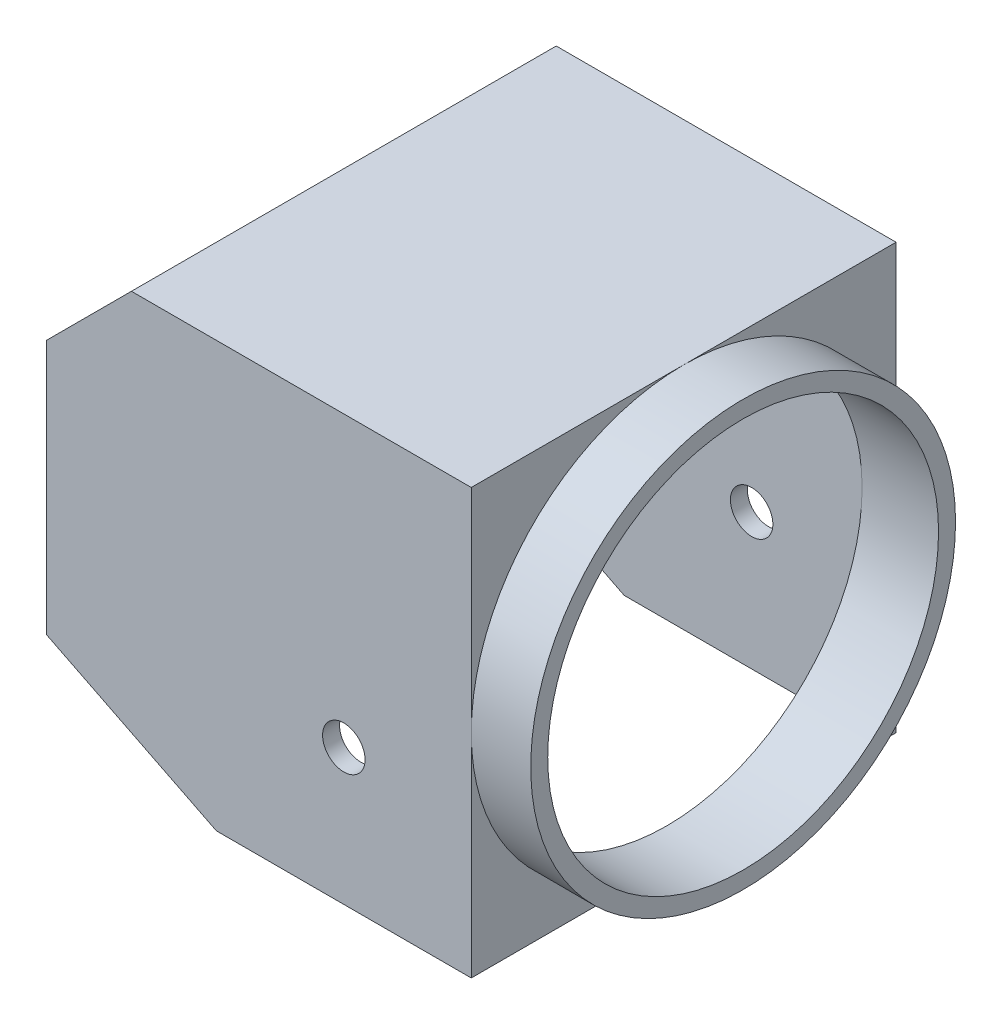
ISO-10303-21;
HEADER;
FILE_DESCRIPTION(('STEP AP214'),'2;1');
FILE_NAME('part.step','',(''),(''),'','','');
FILE_SCHEMA(('AUTOMOTIVE_DESIGN { 1 0 10303 214 1 1 1 1 }'));
ENDSEC;
DATA;
#1=APPLICATION_CONTEXT('core data for automotive mechanical design processes');
#2=APPLICATION_PROTOCOL_DEFINITION('international standard','automotive_design',2000,#1);
#3=PRODUCT_CONTEXT('',#1,'mechanical');
#4=PRODUCT('Part','Part','',(#3));
#5=PRODUCT_RELATED_PRODUCT_CATEGORY('part','',(#4));
#6=PRODUCT_DEFINITION_FORMATION('','',#4);
#7=PRODUCT_DEFINITION_CONTEXT('part definition',#1,'design');
#8=PRODUCT_DEFINITION('design','',#6,#7);
#9=PRODUCT_DEFINITION_SHAPE('','',#8);
#10=(LENGTH_UNIT() NAMED_UNIT(*) SI_UNIT(.MILLI.,.METRE.));
#11=(NAMED_UNIT(*) PLANE_ANGLE_UNIT() SI_UNIT($,.RADIAN.));
#12=(NAMED_UNIT(*) SI_UNIT($,.STERADIAN.) SOLID_ANGLE_UNIT());
#13=UNCERTAINTY_MEASURE_WITH_UNIT(LENGTH_MEASURE(1.E-05),#10,'distance_accuracy_value','');
#14=(GEOMETRIC_REPRESENTATION_CONTEXT(3) GLOBAL_UNCERTAINTY_ASSIGNED_CONTEXT((#13)) GLOBAL_UNIT_ASSIGNED_CONTEXT((#10,
#11,#12)) REPRESENTATION_CONTEXT('',''));
#15=CARTESIAN_POINT('',(0.,0.,0.));
#16=DIRECTION('',(0.,0.,1.));
#17=DIRECTION('',(1.,0.,0.));
#18=AXIS2_PLACEMENT_3D('',#15,#16,#17);
#19=CARTESIAN_POINT('',(-30.,0.,50.));
#20=DIRECTION('',(0.447213595499958,0.894427190999916,0.));
#21=DIRECTION('',(-0.894427190999916,0.447213595499958,0.));
#22=AXIS2_PLACEMENT_3D('',#19,#20,#21);
#23=PLANE('',#22);
#24=DIRECTION('',(0.894427190999916,-0.447213595499958,0.));
#25=VECTOR('',#24,1.);
#26=CARTESIAN_POINT('',(-6.,-12.,2.));
#27=LINE('',#26,#25);
#28=CARTESIAN_POINT('',(-48.,8.99999999999999,2.));
#29=VERTEX_POINT('',#28);
#30=CARTESIAN_POINT('',(-30.,0.,2.));
#31=VERTEX_POINT('',#30);
#32=EDGE_CURVE('E201',#29,#31,#27,.T.);
#33=ORIENTED_EDGE('',*,*,#32,.F.);
#34=DIRECTION('',(0.,0.,-1.));
#35=VECTOR('',#34,1.);
#36=CARTESIAN_POINT('',(-48.,9.,50.));
#37=LINE('',#36,#35);
#38=CARTESIAN_POINT('',(-48.,8.99999999999999,48.));
#39=VERTEX_POINT('',#38);
#40=EDGE_CURVE('E186',#39,#29,#37,.T.);
#41=ORIENTED_EDGE('',*,*,#40,.F.);
#42=DIRECTION('',(0.894427190999916,-0.447213595499958,0.));
#43=VECTOR('',#42,1.);
#44=CARTESIAN_POINT('',(-6.,-12.,48.));
#45=LINE('',#44,#43);
#46=CARTESIAN_POINT('',(-30.,0.,48.));
#47=VERTEX_POINT('',#46);
#48=EDGE_CURVE('E190',#39,#47,#45,.T.);
#49=ORIENTED_EDGE('',*,*,#48,.T.);
#50=DIRECTION('',(0.,0.,-1.));
#51=VECTOR('',#50,1.);
#52=CARTESIAN_POINT('',(-30.,0.,50.));
#53=LINE('',#52,#51);
#54=CARTESIAN_POINT('',(-30.,0.,50.));
#55=VERTEX_POINT('',#54);
#56=EDGE_CURVE('E259',#55,#47,#53,.T.);
#57=ORIENTED_EDGE('',*,*,#56,.F.);
#58=DIRECTION('',(0.894427190999916,-0.447213595499958,0.));
#59=VECTOR('',#58,1.);
#60=CARTESIAN_POINT('',(-30.,0.,50.));
#61=LINE('',#60,#59);
#62=CARTESIAN_POINT('',(-50.,10.,50.));
#63=VERTEX_POINT('',#62);
#64=EDGE_CURVE('E236',#63,#55,#61,.T.);
#65=ORIENTED_EDGE('',*,*,#64,.F.);
#66=DIRECTION('',(0.,0.,-1.));
#67=VECTOR('',#66,1.);
#68=CARTESIAN_POINT('',(-50.,10.,50.));
#69=LINE('',#68,#67);
#70=CARTESIAN_POINT('',(-50.,10.,0.));
#71=VERTEX_POINT('',#70);
#72=EDGE_CURVE('E262',#63,#71,#69,.T.);
#73=ORIENTED_EDGE('',*,*,#72,.T.);
#74=DIRECTION('',(0.894427190999916,-0.447213595499958,0.));
#75=VECTOR('',#74,1.);
#76=CARTESIAN_POINT('',(-30.,0.,0.));
#77=LINE('',#76,#75);
#78=CARTESIAN_POINT('',(-30.,0.,0.));
#79=VERTEX_POINT('',#78);
#80=EDGE_CURVE('E249',#71,#79,#77,.T.);
#81=ORIENTED_EDGE('',*,*,#80,.T.);
#82=EDGE_CURVE('E258',#31,#79,#53,.T.);
#83=ORIENTED_EDGE('',*,*,#82,.F.);
#84=EDGE_LOOP('',(#33,#41,#49,#57,#65,#73,#81,#83));
#85=FACE_BOUND('',#84,.T.);
#86=ADVANCED_FACE('F33',(#85),#23,.F.);
#87=CARTESIAN_POINT('',(0.,0.,50.));
#88=DIRECTION('',(0.,1.,0.));
#89=DIRECTION('',(-1.,0.,0.));
#90=AXIS2_PLACEMENT_3D('',#87,#88,#89);
#91=PLANE('',#90);
#92=DIRECTION('',(1.,0.,0.));
#93=VECTOR('',#92,1.);
#94=CARTESIAN_POINT('',(0.,0.,2.));
#95=LINE('',#94,#93);
#96=CARTESIAN_POINT('',(-2.,0.,2.));
#97=VERTEX_POINT('',#96);
#98=EDGE_CURVE('E203',#31,#97,#95,.T.);
#99=ORIENTED_EDGE('',*,*,#98,.F.);
#100=ORIENTED_EDGE('',*,*,#82,.T.);
#101=DIRECTION('',(1.,0.,0.));
#102=VECTOR('',#101,1.);
#103=CARTESIAN_POINT('',(0.,0.,0.));
#104=LINE('',#103,#102);
#105=CARTESIAN_POINT('',(0.,0.,0.));
#106=VERTEX_POINT('',#105);
#107=EDGE_CURVE('E252',#79,#106,#104,.T.);
#108=ORIENTED_EDGE('',*,*,#107,.T.);
#109=DIRECTION('',(0.,0.,-1.));
#110=VECTOR('',#109,1.);
#111=CARTESIAN_POINT('',(0.,0.,50.));
#112=LINE('',#111,#110);
#113=CARTESIAN_POINT('',(0.,0.,25.));
#114=VERTEX_POINT('',#113);
#115=EDGE_CURVE('E240',#114,#106,#112,.T.);
#116=ORIENTED_EDGE('',*,*,#115,.F.);
#117=CARTESIAN_POINT('',(0.,0.,50.));
#118=VERTEX_POINT('',#117);
#119=EDGE_CURVE('E255',#118,#114,#112,.T.);
#120=ORIENTED_EDGE('',*,*,#119,.F.);
#121=DIRECTION('',(1.,0.,0.));
#122=VECTOR('',#121,1.);
#123=CARTESIAN_POINT('',(0.,0.,50.));
#124=LINE('',#123,#122);
#125=EDGE_CURVE('E238',#55,#118,#124,.T.);
#126=ORIENTED_EDGE('',*,*,#125,.F.);
#127=ORIENTED_EDGE('',*,*,#56,.T.);
#128=DIRECTION('',(1.,0.,0.));
#129=VECTOR('',#128,1.);
#130=CARTESIAN_POINT('',(0.,0.,48.));
#131=LINE('',#130,#129);
#132=CARTESIAN_POINT('',(-2.,0.,48.));
#133=VERTEX_POINT('',#132);
#134=EDGE_CURVE('E194',#47,#133,#131,.T.);
#135=ORIENTED_EDGE('',*,*,#134,.T.);
#136=DIRECTION('',(0.,0.,-1.));
#137=VECTOR('',#136,1.);
#138=CARTESIAN_POINT('',(-2.,0.,50.));
#139=LINE('',#138,#137);
#140=EDGE_CURVE('E191',#133,#97,#139,.T.);
#141=ORIENTED_EDGE('',*,*,#140,.T.);
#142=EDGE_LOOP('',(#99,#100,#108,#116,#120,#126,#127,#135,#141));
#143=FACE_BOUND('',#142,.T.);
#144=ADVANCED_FACE('F297',(#143),#91,.F.);
#145=CARTESIAN_POINT('',(-15.,16.,0.));
#146=DIRECTION('',(0.,0.,1.));
#147=DIRECTION('',(1.,0.,0.));
#148=AXIS2_PLACEMENT_3D('',#145,#146,#147);
#149=CYLINDRICAL_SURFACE('',#148,2.49999999999999);
#150=CARTESIAN_POINT('',(-15.,16.,50.));
#151=DIRECTION('',(0.,0.,1.));
#152=DIRECTION('',(1.,0.,0.));
#153=AXIS2_PLACEMENT_3D('',#150,#151,#152);
#154=CIRCLE('',#153,2.49999999999999);
#155=CARTESIAN_POINT('',(-12.5,16.,50.));
#156=VERTEX_POINT('',#155);
#157=EDGE_CURVE('E217',#156,#156,#154,.T.);
#158=ORIENTED_EDGE('',*,*,#157,.T.);
#159=EDGE_LOOP('',(#158));
#160=FACE_BOUND('',#159,.T.);
#161=CARTESIAN_POINT('',(-15.,16.,48.));
#162=DIRECTION('',(0.,0.,-1.));
#163=DIRECTION('',(-1.,0.,0.));
#164=AXIS2_PLACEMENT_3D('',#161,#162,#163);
#165=CIRCLE('',#164,2.49999999999999);
#166=CARTESIAN_POINT('',(-17.5,16.,48.));
#167=VERTEX_POINT('',#166);
#168=EDGE_CURVE('E209',#167,#167,#165,.F.);
#169=ORIENTED_EDGE('',*,*,#168,.F.);
#170=EDGE_LOOP('',(#169));
#171=FACE_BOUND('',#170,.T.);
#172=ADVANCED_FACE('F308',(#160,#171),#149,.F.);
#173=CARTESIAN_POINT('',(0.,50.,50.));
#174=DIRECTION('',(-1.,0.,0.));
#175=DIRECTION('',(0.,0.,1.));
#176=AXIS2_PLACEMENT_3D('',#173,#174,#175);
#177=PLANE('',#176);
#178=CARTESIAN_POINT('',(0.,25.,25.));
#179=DIRECTION('',(1.,0.,0.));
#180=DIRECTION('',(0.,0.,-1.));
#181=AXIS2_PLACEMENT_3D('',#178,#179,#180);
#182=CIRCLE('',#181,25.);
#183=CARTESIAN_POINT('',(0.,25.,0.));
#184=VERTEX_POINT('',#183);
#185=CARTESIAN_POINT('',(0.,50.,25.));
#186=VERTEX_POINT('',#185);
#187=EDGE_CURVE('E44',#184,#186,#182,.T.);
#188=ORIENTED_EDGE('',*,*,#187,.F.);
#189=DIRECTION('',(0.,1.,0.));
#190=VECTOR('',#189,1.);
#191=CARTESIAN_POINT('',(0.,50.,0.));
#192=LINE('',#191,#190);
#193=CARTESIAN_POINT('',(0.,50.,0.));
#194=VERTEX_POINT('',#193);
#195=EDGE_CURVE('E223',#184,#194,#192,.T.);
#196=ORIENTED_EDGE('',*,*,#195,.T.);
#197=DIRECTION('',(0.,0.,-1.));
#198=VECTOR('',#197,1.);
#199=CARTESIAN_POINT('',(0.,50.,50.));
#200=LINE('',#199,#198);
#201=EDGE_CURVE('E269',#186,#194,#200,.T.);
#202=ORIENTED_EDGE('',*,*,#201,.F.);
#203=EDGE_LOOP('',(#188,#196,#202));
#204=FACE_BOUND('',#203,.T.);
#205=ADVANCED_FACE('F306',(#204),#177,.F.);
#206=CARTESIAN_POINT('',(0.,25.,50.));
#207=VERTEX_POINT('',#206);
#208=EDGE_CURVE('E11',#186,#207,#182,.T.);
#209=ORIENTED_EDGE('',*,*,#208,.F.);
#210=CARTESIAN_POINT('',(0.,50.,50.));
#211=VERTEX_POINT('',#210);
#212=EDGE_CURVE('E37',#211,#186,#200,.T.);
#213=ORIENTED_EDGE('',*,*,#212,.F.);
#214=DIRECTION('',(0.,1.,0.));
#215=VECTOR('',#214,1.);
#216=CARTESIAN_POINT('',(0.,50.,50.));
#217=LINE('',#216,#215);
#218=EDGE_CURVE('E230',#207,#211,#217,.T.);
#219=ORIENTED_EDGE('',*,*,#218,.F.);
#220=EDGE_LOOP('',(#209,#213,#219));
#221=FACE_BOUND('',#220,.T.);
#222=ADVANCED_FACE('F289',(#221),#177,.F.);
#223=EDGE_CURVE('E42',#207,#114,#182,.T.);
#224=ORIENTED_EDGE('',*,*,#223,.F.);
#225=EDGE_CURVE('E226',#118,#207,#217,.T.);
#226=ORIENTED_EDGE('',*,*,#225,.F.);
#227=ORIENTED_EDGE('',*,*,#119,.T.);
#228=EDGE_LOOP('',(#224,#226,#227));
#229=FACE_BOUND('',#228,.T.);
#230=ADVANCED_FACE('F286',(#229),#177,.F.);
#231=EDGE_CURVE('E59',#114,#184,#182,.T.);
#232=ORIENTED_EDGE('',*,*,#231,.F.);
#233=ORIENTED_EDGE('',*,*,#115,.T.);
#234=EDGE_CURVE('E241',#106,#184,#192,.T.);
#235=ORIENTED_EDGE('',*,*,#234,.T.);
#236=EDGE_LOOP('',(#232,#233,#235));
#237=FACE_BOUND('',#236,.T.);
#238=ADVANCED_FACE('F35',(#237),#177,.F.);
#239=CARTESIAN_POINT('',(-40.,50.,50.));
#240=DIRECTION('',(0.,-1.,0.));
#241=DIRECTION('',(0.,0.,-1.));
#242=AXIS2_PLACEMENT_3D('',#239,#240,#241);
#243=PLANE('',#242);
#244=DIRECTION('',(-1.,0.,0.));
#245=VECTOR('',#244,1.);
#246=CARTESIAN_POINT('',(-40.,50.,0.));
#247=LINE('',#246,#245);
#248=CARTESIAN_POINT('',(-40.,50.,0.));
#249=VERTEX_POINT('',#248);
#250=EDGE_CURVE('E243',#194,#249,#247,.T.);
#251=ORIENTED_EDGE('',*,*,#250,.T.);
#252=DIRECTION('',(0.,0.,-1.));
#253=VECTOR('',#252,1.);
#254=CARTESIAN_POINT('',(-40.,50.,50.));
#255=LINE('',#254,#253);
#256=CARTESIAN_POINT('',(-40.,50.,50.));
#257=VERTEX_POINT('',#256);
#258=EDGE_CURVE('E267',#257,#249,#255,.T.);
#259=ORIENTED_EDGE('',*,*,#258,.F.);
#260=DIRECTION('',(-1.,0.,0.));
#261=VECTOR('',#260,1.);
#262=CARTESIAN_POINT('',(-40.,50.,50.));
#263=LINE('',#262,#261);
#264=EDGE_CURVE('E229',#211,#257,#263,.T.);
#265=ORIENTED_EDGE('',*,*,#264,.F.);
#266=ORIENTED_EDGE('',*,*,#212,.T.);
#267=ORIENTED_EDGE('',*,*,#201,.T.);
#268=EDGE_LOOP('',(#251,#259,#265,#266,#267));
#269=FACE_BOUND('',#268,.T.);
#270=ADVANCED_FACE('F317',(#269),#243,.F.);
#271=CARTESIAN_POINT('',(-50.,40.,50.));
#272=DIRECTION('',(0.707106781186548,-0.707106781186547,0.));
#273=DIRECTION('',(0.707106781186547,0.707106781186548,0.));
#274=AXIS2_PLACEMENT_3D('',#271,#272,#273);
#275=PLANE('',#274);
#276=DIRECTION('',(-0.707106781186547,-0.707106781186548,0.));
#277=VECTOR('',#276,1.);
#278=CARTESIAN_POINT('',(-50.,40.,0.));
#279=LINE('',#278,#277);
#280=CARTESIAN_POINT('',(-50.,40.,0.));
#281=VERTEX_POINT('',#280);
#282=EDGE_CURVE('E245',#249,#281,#279,.T.);
#283=ORIENTED_EDGE('',*,*,#282,.T.);
#284=DIRECTION('',(0.,0.,-1.));
#285=VECTOR('',#284,1.);
#286=CARTESIAN_POINT('',(-50.,40.,50.));
#287=LINE('',#286,#285);
#288=CARTESIAN_POINT('',(-50.,40.,50.));
#289=VERTEX_POINT('',#288);
#290=EDGE_CURVE('E265',#289,#281,#287,.T.);
#291=ORIENTED_EDGE('',*,*,#290,.F.);
#292=DIRECTION('',(-0.707106781186547,-0.707106781186548,0.));
#293=VECTOR('',#292,1.);
#294=CARTESIAN_POINT('',(-50.,40.,50.));
#295=LINE('',#294,#293);
#296=EDGE_CURVE('E232',#257,#289,#295,.T.);
#297=ORIENTED_EDGE('',*,*,#296,.F.);
#298=ORIENTED_EDGE('',*,*,#258,.T.);
#299=EDGE_LOOP('',(#283,#291,#297,#298));
#300=FACE_BOUND('',#299,.T.);
#301=ADVANCED_FACE('F331',(#300),#275,.F.);
#302=CARTESIAN_POINT('',(-50.,10.,50.));
#303=DIRECTION('',(1.,0.,0.));
#304=DIRECTION('',(0.,0.,-1.));
#305=AXIS2_PLACEMENT_3D('',#302,#303,#304);
#306=PLANE('',#305);
#307=DIRECTION('',(0.,-1.,0.));
#308=VECTOR('',#307,1.);
#309=CARTESIAN_POINT('',(-50.,10.,0.));
#310=LINE('',#309,#308);
#311=EDGE_CURVE('E247',#281,#71,#310,.T.);
#312=ORIENTED_EDGE('',*,*,#311,.T.);
#313=ORIENTED_EDGE('',*,*,#72,.F.);
#314=DIRECTION('',(0.,-1.,0.));
#315=VECTOR('',#314,1.);
#316=CARTESIAN_POINT('',(-50.,10.,50.));
#317=LINE('',#316,#315);
#318=EDGE_CURVE('E234',#289,#63,#317,.T.);
#319=ORIENTED_EDGE('',*,*,#318,.F.);
#320=ORIENTED_EDGE('',*,*,#290,.T.);
#321=EDGE_LOOP('',(#312,#313,#319,#320));
#322=FACE_BOUND('',#321,.T.);
#323=ADVANCED_FACE('F328',(#322),#306,.F.);
#324=CARTESIAN_POINT('',(0.,0.,50.));
#325=DIRECTION('',(0.,0.,-1.));
#326=DIRECTION('',(-1.,0.,0.));
#327=AXIS2_PLACEMENT_3D('',#324,#325,#326);
#328=PLANE('',#327);
#329=ORIENTED_EDGE('',*,*,#157,.F.);
#330=EDGE_LOOP('',(#329));
#331=FACE_BOUND('',#330,.T.);
#332=ORIENTED_EDGE('',*,*,#225,.T.);
#333=ORIENTED_EDGE('',*,*,#218,.T.);
#334=ORIENTED_EDGE('',*,*,#264,.T.);
#335=ORIENTED_EDGE('',*,*,#296,.T.);
#336=ORIENTED_EDGE('',*,*,#318,.T.);
#337=ORIENTED_EDGE('',*,*,#64,.T.);
#338=ORIENTED_EDGE('',*,*,#125,.T.);
#339=EDGE_LOOP('',(#332,#333,#334,#335,#336,#337,#338));
#340=FACE_BOUND('',#339,.T.);
#341=ADVANCED_FACE('F291',(#331,#340),#328,.F.);
#342=CARTESIAN_POINT('',(0.,0.,0.));
#343=DIRECTION('',(0.,0.,-1.));
#344=DIRECTION('',(-1.,0.,0.));
#345=AXIS2_PLACEMENT_3D('',#342,#343,#344);
#346=PLANE('',#345);
#347=CARTESIAN_POINT('',(-15.,16.,0.));
#348=DIRECTION('',(0.,0.,1.));
#349=DIRECTION('',(1.,0.,0.));
#350=AXIS2_PLACEMENT_3D('',#347,#348,#349);
#351=CIRCLE('',#350,2.49999999999999);
#352=CARTESIAN_POINT('',(-12.5,16.,0.));
#353=VERTEX_POINT('',#352);
#354=EDGE_CURVE('E214',#353,#353,#351,.T.);
#355=ORIENTED_EDGE('',*,*,#354,.T.);
#356=EDGE_LOOP('',(#355));
#357=FACE_BOUND('',#356,.T.);
#358=ORIENTED_EDGE('',*,*,#234,.F.);
#359=ORIENTED_EDGE('',*,*,#107,.F.);
#360=ORIENTED_EDGE('',*,*,#80,.F.);
#361=ORIENTED_EDGE('',*,*,#311,.F.);
#362=ORIENTED_EDGE('',*,*,#282,.F.);
#363=ORIENTED_EDGE('',*,*,#250,.F.);
#364=ORIENTED_EDGE('',*,*,#195,.F.);
#365=EDGE_LOOP('',(#358,#359,#360,#361,#362,#363,#364));
#366=FACE_BOUND('',#365,.T.);
#367=ADVANCED_FACE('F304',(#357,#366),#346,.T.);
#368=CARTESIAN_POINT('',(7.,25.,25.));
#369=DIRECTION('',(-1.,0.,0.));
#370=DIRECTION('',(0.,0.,1.));
#371=AXIS2_PLACEMENT_3D('',#368,#369,#370);
#372=CYLINDRICAL_SURFACE('',#371,25.);
#373=CARTESIAN_POINT('',(7.,25.,25.));
#374=DIRECTION('',(1.,0.,0.));
#375=DIRECTION('',(0.,0.,-1.));
#376=AXIS2_PLACEMENT_3D('',#373,#374,#375);
#377=CIRCLE('',#376,25.);
#378=CARTESIAN_POINT('',(7.,25.,0.));
#379=VERTEX_POINT('',#378);
#380=EDGE_CURVE('E221',#379,#379,#377,.T.);
#381=ORIENTED_EDGE('',*,*,#380,.F.);
#382=EDGE_LOOP('',(#381));
#383=FACE_BOUND('',#382,.T.);
#384=ORIENTED_EDGE('',*,*,#187,.T.);
#385=ORIENTED_EDGE('',*,*,#208,.T.);
#386=ORIENTED_EDGE('',*,*,#223,.T.);
#387=ORIENTED_EDGE('',*,*,#231,.T.);
#388=EDGE_LOOP('',(#384,#385,#386,#387));
#389=FACE_BOUND('',#388,.T.);
#390=ADVANCED_FACE('F282',(#383,#389),#372,.T.);
#391=CARTESIAN_POINT('',(7.,25.,25.));
#392=DIRECTION('',(1.,0.,0.));
#393=DIRECTION('',(0.,0.,-1.));
#394=AXIS2_PLACEMENT_3D('',#391,#392,#393);
#395=PLANE('',#394);
#396=CARTESIAN_POINT('',(7.,25.,25.));
#397=DIRECTION('',(1.,0.,0.));
#398=DIRECTION('',(0.,0.,-1.));
#399=AXIS2_PLACEMENT_3D('',#396,#397,#398);
#400=CIRCLE('',#399,23.);
#401=CARTESIAN_POINT('',(7.,25.,2.));
#402=VERTEX_POINT('',#401);
#403=EDGE_CURVE('E167',#402,#402,#400,.T.);
#404=ORIENTED_EDGE('',*,*,#403,.F.);
#405=EDGE_LOOP('',(#404));
#406=FACE_BOUND('',#405,.T.);
#407=ORIENTED_EDGE('',*,*,#380,.T.);
#408=EDGE_LOOP('',(#407));
#409=FACE_BOUND('',#408,.T.);
#410=ADVANCED_FACE('F393',(#406,#409),#395,.T.);
#411=CARTESIAN_POINT('',(-15.,16.,2.));
#412=DIRECTION('',(0.,0.,-1.));
#413=DIRECTION('',(-1.,0.,0.));
#414=AXIS2_PLACEMENT_3D('',#411,#412,#413);
#415=CIRCLE('',#414,2.49999999999999);
#416=CARTESIAN_POINT('',(-17.5,16.,2.));
#417=VERTEX_POINT('',#416);
#418=EDGE_CURVE('E206',#417,#417,#415,.F.);
#419=ORIENTED_EDGE('',*,*,#418,.T.);
#420=EDGE_LOOP('',(#419));
#421=FACE_BOUND('',#420,.T.);
#422=ORIENTED_EDGE('',*,*,#354,.F.);
#423=EDGE_LOOP('',(#422));
#424=FACE_BOUND('',#423,.T.);
#425=ADVANCED_FACE('F315',(#421,#424),#149,.F.);
#426=CARTESIAN_POINT('',(-2.,50.,50.));
#427=DIRECTION('',(-1.,0.,0.));
#428=DIRECTION('',(0.,0.,1.));
#429=AXIS2_PLACEMENT_3D('',#426,#427,#428);
#430=PLANE('',#429);
#431=CARTESIAN_POINT('',(-2.,25.,25.));
#432=DIRECTION('',(-1.,0.,0.));
#433=DIRECTION('',(0.,0.,1.));
#434=AXIS2_PLACEMENT_3D('',#431,#432,#433);
#435=CIRCLE('',#434,23.);
#436=CARTESIAN_POINT('',(-2.,25.,2.));
#437=VERTEX_POINT('',#436);
#438=CARTESIAN_POINT('',(-2.,48.,25.));
#439=VERTEX_POINT('',#438);
#440=EDGE_CURVE('E153',#437,#439,#435,.F.);
#441=ORIENTED_EDGE('',*,*,#440,.T.);
#442=DIRECTION('',(0.,0.,-1.));
#443=VECTOR('',#442,1.);
#444=CARTESIAN_POINT('',(-2.,48.,50.));
#445=LINE('',#444,#443);
#446=CARTESIAN_POINT('',(-2.,48.,2.));
#447=VERTEX_POINT('',#446);
#448=EDGE_CURVE('E148',#439,#447,#445,.T.);
#449=ORIENTED_EDGE('',*,*,#448,.T.);
#450=DIRECTION('',(0.,1.,0.));
#451=VECTOR('',#450,1.);
#452=CARTESIAN_POINT('',(-2.,0.,2.));
#453=LINE('',#452,#451);
#454=EDGE_CURVE('E151',#437,#447,#453,.T.);
#455=ORIENTED_EDGE('',*,*,#454,.F.);
#456=EDGE_LOOP('',(#441,#449,#455));
#457=FACE_BOUND('',#456,.T.);
#458=ADVANCED_FACE('F150',(#457),#430,.T.);
#459=CARTESIAN_POINT('',(-2.,25.,25.));
#460=DIRECTION('',(-1.,0.,0.));
#461=DIRECTION('',(0.,0.,1.));
#462=AXIS2_PLACEMENT_3D('',#459,#460,#461);
#463=CIRCLE('',#462,23.);
#464=CARTESIAN_POINT('',(-2.,25.,48.));
#465=VERTEX_POINT('',#464);
#466=EDGE_CURVE('E220',#439,#465,#463,.F.);
#467=ORIENTED_EDGE('',*,*,#466,.T.);
#468=DIRECTION('',(0.,1.,0.));
#469=VECTOR('',#468,1.);
#470=CARTESIAN_POINT('',(-2.,0.,48.));
#471=LINE('',#470,#469);
#472=CARTESIAN_POINT('',(-2.,48.,48.));
#473=VERTEX_POINT('',#472);
#474=EDGE_CURVE('E205',#465,#473,#471,.T.);
#475=ORIENTED_EDGE('',*,*,#474,.T.);
#476=DIRECTION('',(0.,0.,-1.));
#477=VECTOR('',#476,1.);
#478=CARTESIAN_POINT('',(-2.,48.,50.));
#479=LINE('',#478,#477);
#480=EDGE_CURVE('E158',#473,#439,#479,.T.);
#481=ORIENTED_EDGE('',*,*,#480,.T.);
#482=EDGE_LOOP('',(#467,#475,#481));
#483=FACE_BOUND('',#482,.T.);
#484=ADVANCED_FACE('F369',(#483),#430,.T.);
#485=CARTESIAN_POINT('',(-2.,25.,25.));
#486=DIRECTION('',(-1.,0.,0.));
#487=DIRECTION('',(0.,0.,1.));
#488=AXIS2_PLACEMENT_3D('',#485,#486,#487);
#489=CIRCLE('',#488,23.);
#490=EDGE_CURVE('E357',#465,#437,#489,.F.);
#491=ORIENTED_EDGE('',*,*,#490,.T.);
#492=DIRECTION('',(0.,1.,0.));
#493=VECTOR('',#492,1.);
#494=CARTESIAN_POINT('',(-2.,0.,2.));
#495=LINE('',#494,#493);
#496=EDGE_CURVE('E166',#97,#437,#495,.T.);
#497=ORIENTED_EDGE('',*,*,#496,.F.);
#498=ORIENTED_EDGE('',*,*,#140,.F.);
#499=DIRECTION('',(0.,1.,0.));
#500=VECTOR('',#499,1.);
#501=CARTESIAN_POINT('',(-2.,0.,48.));
#502=LINE('',#501,#500);
#503=EDGE_CURVE('E51',#133,#465,#502,.T.);
#504=ORIENTED_EDGE('',*,*,#503,.T.);
#505=EDGE_LOOP('',(#491,#497,#498,#504));
#506=FACE_BOUND('',#505,.T.);
#507=ADVANCED_FACE('F365',(#506),#430,.T.);
#508=CARTESIAN_POINT('',(-40.,48.,50.));
#509=DIRECTION('',(0.,-1.,0.));
#510=DIRECTION('',(0.,0.,-1.));
#511=AXIS2_PLACEMENT_3D('',#508,#509,#510);
#512=PLANE('',#511);
#513=DIRECTION('',(-1.,0.,0.));
#514=VECTOR('',#513,1.);
#515=CARTESIAN_POINT('',(0.,48.,2.));
#516=LINE('',#515,#514);
#517=CARTESIAN_POINT('',(-39.1715728752538,48.,2.));
#518=VERTEX_POINT('',#517);
#519=EDGE_CURVE('E163',#447,#518,#516,.T.);
#520=ORIENTED_EDGE('',*,*,#519,.F.);
#521=ORIENTED_EDGE('',*,*,#448,.F.);
#522=ORIENTED_EDGE('',*,*,#480,.F.);
#523=DIRECTION('',(-1.,0.,0.));
#524=VECTOR('',#523,1.);
#525=CARTESIAN_POINT('',(0.,48.,48.));
#526=LINE('',#525,#524);
#527=CARTESIAN_POINT('',(-39.1715728752538,48.,48.));
#528=VERTEX_POINT('',#527);
#529=EDGE_CURVE('E181',#473,#528,#526,.T.);
#530=ORIENTED_EDGE('',*,*,#529,.T.);
#531=DIRECTION('',(0.,0.,-1.));
#532=VECTOR('',#531,1.);
#533=CARTESIAN_POINT('',(-39.1715728752538,48.,50.));
#534=LINE('',#533,#532);
#535=EDGE_CURVE('E159',#528,#518,#534,.T.);
#536=ORIENTED_EDGE('',*,*,#535,.T.);
#537=EDGE_LOOP('',(#520,#521,#522,#530,#536));
#538=FACE_BOUND('',#537,.T.);
#539=ADVANCED_FACE('F169',(#538),#512,.T.);
#540=CARTESIAN_POINT('',(-48.5857864376269,38.5857864376269,50.));
#541=DIRECTION('',(0.707106781186548,-0.707106781186547,0.));
#542=DIRECTION('',(0.707106781186547,0.707106781186548,0.));
#543=AXIS2_PLACEMENT_3D('',#540,#541,#542);
#544=PLANE('',#543);
#545=DIRECTION('',(-0.707106781186547,-0.707106781186548,0.));
#546=VECTOR('',#545,1.);
#547=CARTESIAN_POINT('',(-43.5857864376269,43.5857864376269,2.));
#548=LINE('',#547,#546);
#549=CARTESIAN_POINT('',(-48.,39.1715728752538,2.));
#550=VERTEX_POINT('',#549);
#551=EDGE_CURVE('E172',#518,#550,#548,.T.);
#552=ORIENTED_EDGE('',*,*,#551,.F.);
#553=ORIENTED_EDGE('',*,*,#535,.F.);
#554=DIRECTION('',(-0.707106781186547,-0.707106781186548,0.));
#555=VECTOR('',#554,1.);
#556=CARTESIAN_POINT('',(-43.5857864376269,43.5857864376269,48.));
#557=LINE('',#556,#555);
#558=CARTESIAN_POINT('',(-48.,39.1715728752538,48.));
#559=VERTEX_POINT('',#558);
#560=EDGE_CURVE('E183',#528,#559,#557,.T.);
#561=ORIENTED_EDGE('',*,*,#560,.T.);
#562=DIRECTION('',(0.,0.,-1.));
#563=VECTOR('',#562,1.);
#564=CARTESIAN_POINT('',(-48.,39.1715728752538,50.));
#565=LINE('',#564,#563);
#566=EDGE_CURVE('E180',#559,#550,#565,.T.);
#567=ORIENTED_EDGE('',*,*,#566,.T.);
#568=EDGE_LOOP('',(#552,#553,#561,#567));
#569=FACE_BOUND('',#568,.T.);
#570=ADVANCED_FACE('F353',(#569),#544,.T.);
#571=CARTESIAN_POINT('',(-48.,10.,50.));
#572=DIRECTION('',(1.,0.,0.));
#573=DIRECTION('',(0.,0.,-1.));
#574=AXIS2_PLACEMENT_3D('',#571,#572,#573);
#575=PLANE('',#574);
#576=DIRECTION('',(0.,-1.,0.));
#577=VECTOR('',#576,1.);
#578=CARTESIAN_POINT('',(-48.,0.,2.));
#579=LINE('',#578,#577);
#580=EDGE_CURVE('E174',#550,#29,#579,.T.);
#581=ORIENTED_EDGE('',*,*,#580,.F.);
#582=ORIENTED_EDGE('',*,*,#566,.F.);
#583=DIRECTION('',(0.,-1.,0.));
#584=VECTOR('',#583,1.);
#585=CARTESIAN_POINT('',(-48.,0.,48.));
#586=LINE('',#585,#584);
#587=EDGE_CURVE('E188',#559,#39,#586,.T.);
#588=ORIENTED_EDGE('',*,*,#587,.T.);
#589=ORIENTED_EDGE('',*,*,#40,.T.);
#590=EDGE_LOOP('',(#581,#582,#588,#589));
#591=FACE_BOUND('',#590,.T.);
#592=ADVANCED_FACE('F350',(#591),#575,.T.);
#593=CARTESIAN_POINT('',(0.,0.,48.));
#594=DIRECTION('',(0.,0.,-1.));
#595=DIRECTION('',(-1.,0.,0.));
#596=AXIS2_PLACEMENT_3D('',#593,#594,#595);
#597=PLANE('',#596);
#598=ORIENTED_EDGE('',*,*,#168,.T.);
#599=EDGE_LOOP('',(#598));
#600=FACE_BOUND('',#599,.T.);
#601=ORIENTED_EDGE('',*,*,#503,.F.);
#602=ORIENTED_EDGE('',*,*,#134,.F.);
#603=ORIENTED_EDGE('',*,*,#48,.F.);
#604=ORIENTED_EDGE('',*,*,#587,.F.);
#605=ORIENTED_EDGE('',*,*,#560,.F.);
#606=ORIENTED_EDGE('',*,*,#529,.F.);
#607=ORIENTED_EDGE('',*,*,#474,.F.);
#608=EDGE_LOOP('',(#601,#602,#603,#604,#605,#606,#607));
#609=FACE_BOUND('',#608,.T.);
#610=ADVANCED_FACE('F344',(#600,#609),#597,.T.);
#611=CARTESIAN_POINT('',(0.,0.,2.));
#612=DIRECTION('',(0.,0.,-1.));
#613=DIRECTION('',(-1.,0.,0.));
#614=AXIS2_PLACEMENT_3D('',#611,#612,#613);
#615=PLANE('',#614);
#616=ORIENTED_EDGE('',*,*,#418,.F.);
#617=EDGE_LOOP('',(#616));
#618=FACE_BOUND('',#617,.T.);
#619=ORIENTED_EDGE('',*,*,#496,.T.);
#620=ORIENTED_EDGE('',*,*,#454,.T.);
#621=ORIENTED_EDGE('',*,*,#519,.T.);
#622=ORIENTED_EDGE('',*,*,#551,.T.);
#623=ORIENTED_EDGE('',*,*,#580,.T.);
#624=ORIENTED_EDGE('',*,*,#32,.T.);
#625=ORIENTED_EDGE('',*,*,#98,.T.);
#626=EDGE_LOOP('',(#619,#620,#621,#622,#623,#624,#625));
#627=FACE_BOUND('',#626,.T.);
#628=ADVANCED_FACE('F162',(#618,#627),#615,.F.);
#629=CARTESIAN_POINT('',(7.,25.,25.));
#630=DIRECTION('',(-1.,0.,0.));
#631=DIRECTION('',(0.,0.,1.));
#632=AXIS2_PLACEMENT_3D('',#629,#630,#631);
#633=CYLINDRICAL_SURFACE('',#632,23.);
#634=ORIENTED_EDGE('',*,*,#403,.T.);
#635=EDGE_LOOP('',(#634));
#636=FACE_BOUND('',#635,.T.);
#637=ORIENTED_EDGE('',*,*,#440,.F.);
#638=ORIENTED_EDGE('',*,*,#490,.F.);
#639=ORIENTED_EDGE('',*,*,#466,.F.);
#640=EDGE_LOOP('',(#637,#638,#639));
#641=FACE_BOUND('',#640,.T.);
#642=ADVANCED_FACE('F367',(#636,#641),#633,.F.);
#643=CLOSED_SHELL('',(#86,#144,#172,#205,#222,#230,#238,#270,#301,#323,#341,#367,#390,#410,#425,
#458,#484,#507,#539,#570,#592,#610,#628,#642));
#644=MANIFOLD_SOLID_BREP('B2',#643);
#645=ADVANCED_BREP_SHAPE_REPRESENTATION('',(#18,#644),#14);
#646=SHAPE_DEFINITION_REPRESENTATION(#9,#645);
ENDSEC;
END-ISO-10303-21;
